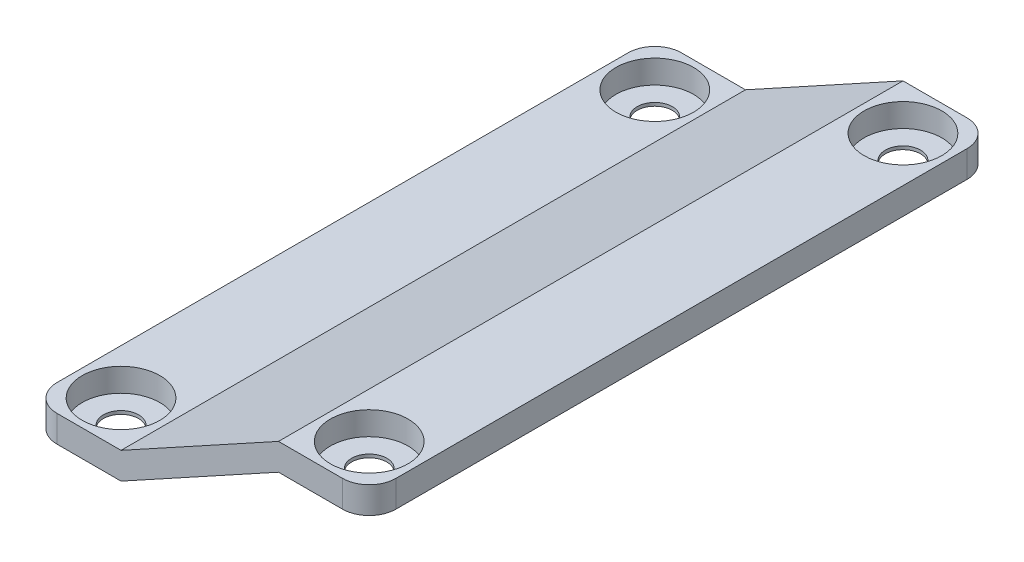
ISO-10303-21;
HEADER;
FILE_DESCRIPTION(('STEP AP214'),'2;1');
FILE_NAME('part.step','',(''),(''),'','','');
FILE_SCHEMA(('AUTOMOTIVE_DESIGN { 1 0 10303 214 1 1 1 1 }'));
ENDSEC;
DATA;
#1=APPLICATION_CONTEXT('core data for automotive mechanical design processes');
#2=APPLICATION_PROTOCOL_DEFINITION('international standard','automotive_design',2000,#1);
#3=PRODUCT_CONTEXT('',#1,'mechanical');
#4=PRODUCT('Part','Part','',(#3));
#5=PRODUCT_RELATED_PRODUCT_CATEGORY('part','',(#4));
#6=PRODUCT_DEFINITION_FORMATION('','',#4);
#7=PRODUCT_DEFINITION_CONTEXT('part definition',#1,'design');
#8=PRODUCT_DEFINITION('design','',#6,#7);
#9=PRODUCT_DEFINITION_SHAPE('','',#8);
#10=(LENGTH_UNIT() NAMED_UNIT(*) SI_UNIT(.MILLI.,.METRE.));
#11=(NAMED_UNIT(*) PLANE_ANGLE_UNIT() SI_UNIT($,.RADIAN.));
#12=(NAMED_UNIT(*) SI_UNIT($,.STERADIAN.) SOLID_ANGLE_UNIT());
#13=UNCERTAINTY_MEASURE_WITH_UNIT(LENGTH_MEASURE(1.E-05),#10,'distance_accuracy_value','');
#14=(GEOMETRIC_REPRESENTATION_CONTEXT(3) GLOBAL_UNCERTAINTY_ASSIGNED_CONTEXT((#13)) GLOBAL_UNIT_ASSIGNED_CONTEXT((#10,
#11,#12)) REPRESENTATION_CONTEXT('',''));
#15=CARTESIAN_POINT('',(0.,0.,0.));
#16=DIRECTION('',(0.,0.,1.));
#17=DIRECTION('',(1.,0.,0.));
#18=AXIS2_PLACEMENT_3D('',#15,#16,#17);
#19=CARTESIAN_POINT('',(-15.0077541769523,-9.56898329219079,-117.));
#20=DIRECTION('',(0.,-1.,0.));
#21=DIRECTION('',(1.,0.,0.));
#22=AXIS2_PLACEMENT_3D('',#19,#20,#21);
#23=PLANE('',#22);
#24=DIRECTION('',(0.,0.,1.));
#25=VECTOR('',#24,1.);
#26=CARTESIAN_POINT('',(-32.0077541769523,-9.5689832921908,-117.));
#27=LINE('',#26,#25);
#28=CARTESIAN_POINT('',(-32.0077541769523,-9.5689832921908,-112.));
#29=VERTEX_POINT('',#28);
#30=CARTESIAN_POINT('',(-32.0077541769523,-9.5689832921908,-5.));
#31=VERTEX_POINT('',#30);
#32=EDGE_CURVE('E198',#29,#31,#27,.T.);
#33=ORIENTED_EDGE('',*,*,#32,.F.);
#34=CARTESIAN_POINT('',(-27.0077541769523,-9.56898329219079,-112.));
#35=DIRECTION('',(0.,-1.,0.));
#36=DIRECTION('',(1.,0.,0.));
#37=AXIS2_PLACEMENT_3D('',#34,#35,#36);
#38=CIRCLE('',#37,5.);
#39=CARTESIAN_POINT('',(-27.0077541769523,-9.56898329219079,-117.));
#40=VERTEX_POINT('',#39);
#41=EDGE_CURVE('E228',#29,#40,#38,.T.);
#42=ORIENTED_EDGE('',*,*,#41,.T.);
#43=DIRECTION('',(1.,0.,0.));
#44=VECTOR('',#43,1.);
#45=CARTESIAN_POINT('',(-15.0077541769523,-9.56898329219079,-117.));
#46=LINE('',#45,#44);
#47=CARTESIAN_POINT('',(-15.0077541769523,-9.56898329219079,-117.));
#48=VERTEX_POINT('',#47);
#49=EDGE_CURVE('E141',#40,#48,#46,.T.);
#50=ORIENTED_EDGE('',*,*,#49,.T.);
#51=DIRECTION('',(0.,0.,1.));
#52=VECTOR('',#51,1.);
#53=CARTESIAN_POINT('',(-15.0077541769523,-9.56898329219079,-117.));
#54=LINE('',#53,#52);
#55=CARTESIAN_POINT('',(-15.0077541769523,-9.56898329219079,0.));
#56=VERTEX_POINT('',#55);
#57=EDGE_CURVE('E157',#48,#56,#54,.T.);
#58=ORIENTED_EDGE('',*,*,#57,.T.);
#59=DIRECTION('',(1.,0.,0.));
#60=VECTOR('',#59,1.);
#61=CARTESIAN_POINT('',(-15.0077541769523,-9.56898329219079,0.));
#62=LINE('',#61,#60);
#63=CARTESIAN_POINT('',(-27.0077541769523,-9.56898329219079,0.));
#64=VERTEX_POINT('',#63);
#65=EDGE_CURVE('E159',#64,#56,#62,.T.);
#66=ORIENTED_EDGE('',*,*,#65,.F.);
#67=CARTESIAN_POINT('',(-27.0077541769523,-9.56898329219079,-5.));
#68=DIRECTION('',(0.,-1.,0.));
#69=DIRECTION('',(1.,0.,0.));
#70=AXIS2_PLACEMENT_3D('',#67,#68,#69);
#71=CIRCLE('',#70,5.);
#72=EDGE_CURVE('E225',#64,#31,#71,.T.);
#73=ORIENTED_EDGE('',*,*,#72,.T.);
#74=EDGE_LOOP('',(#33,#42,#50,#58,#66,#73));
#75=FACE_BOUND('',#74,.T.);
#76=CARTESIAN_POINT('',(-23.5077541769523,-9.56898329219079,-8.5));
#77=DIRECTION('',(0.,1.,0.));
#78=DIRECTION('',(0.,0.,1.));
#79=AXIS2_PLACEMENT_3D('',#76,#77,#78);
#80=CIRCLE('',#79,3.3);
#81=CARTESIAN_POINT('',(-23.5077541769523,-9.56898329219079,-5.2));
#82=VERTEX_POINT('',#81);
#83=EDGE_CURVE('E165',#82,#82,#80,.T.);
#84=ORIENTED_EDGE('',*,*,#83,.T.);
#85=EDGE_LOOP('',(#84));
#86=FACE_BOUND('',#85,.T.);
#87=CARTESIAN_POINT('',(-23.5077541769523,-9.56898329219079,-108.5));
#88=DIRECTION('',(0.,1.,0.));
#89=DIRECTION('',(0.,0.,1.));
#90=AXIS2_PLACEMENT_3D('',#87,#88,#89);
#91=CIRCLE('',#90,3.3);
#92=CARTESIAN_POINT('',(-23.5077541769523,-9.56898329219079,-105.2));
#93=VERTEX_POINT('',#92);
#94=EDGE_CURVE('E364',#93,#93,#91,.T.);
#95=ORIENTED_EDGE('',*,*,#94,.T.);
#96=EDGE_LOOP('',(#95));
#97=FACE_BOUND('',#96,.T.);
#98=ADVANCED_FACE('F39',(#75,#86,#97),#23,.T.);
#99=CARTESIAN_POINT('',(-15.0077541769523,-9.56898329219079,-117.));
#100=DIRECTION('',(0.48134834326553,-0.876529390514391,0.));
#101=DIRECTION('',(0.876529390514391,0.48134834326553,0.));
#102=AXIS2_PLACEMENT_3D('',#99,#100,#101);
#103=PLANE('',#102);
#104=DIRECTION('',(0.876529390514391,0.48134834326553,0.));
#105=VECTOR('',#104,1.);
#106=CARTESIAN_POINT('',(-15.0077541769523,-9.56898329219079,0.));
#107=LINE('',#106,#105);
#108=CARTESIAN_POINT('',(14.4922458230477,6.6310167078092,0.));
#109=VERTEX_POINT('',#108);
#110=EDGE_CURVE('E180',#56,#109,#107,.T.);
#111=ORIENTED_EDGE('',*,*,#110,.F.);
#112=ORIENTED_EDGE('',*,*,#57,.F.);
#113=DIRECTION('',(0.876529390514391,0.48134834326553,0.));
#114=VECTOR('',#113,1.);
#115=CARTESIAN_POINT('',(-15.0077541769523,-9.56898329219079,-117.));
#116=LINE('',#115,#114);
#117=CARTESIAN_POINT('',(14.4922458230477,6.6310167078092,-117.));
#118=VERTEX_POINT('',#117);
#119=EDGE_CURVE('E147',#48,#118,#116,.T.);
#120=ORIENTED_EDGE('',*,*,#119,.T.);
#121=DIRECTION('',(0.,0.,1.));
#122=VECTOR('',#121,1.);
#123=CARTESIAN_POINT('',(14.4922458230477,6.6310167078092,-117.));
#124=LINE('',#123,#122);
#125=EDGE_CURVE('E129',#118,#109,#124,.T.);
#126=ORIENTED_EDGE('',*,*,#125,.T.);
#127=EDGE_LOOP('',(#111,#112,#120,#126));
#128=FACE_BOUND('',#127,.T.);
#129=ADVANCED_FACE('F155',(#128),#103,.T.);
#130=CARTESIAN_POINT('',(-32.0077541769523,-9.5689832921908,-117.));
#131=DIRECTION('',(-1.,0.,0.));
#132=DIRECTION('',(0.,0.,1.));
#133=AXIS2_PLACEMENT_3D('',#130,#131,#132);
#134=PLANE('',#133);
#135=DIRECTION('',(0.,0.,1.));
#136=VECTOR('',#135,1.);
#137=CARTESIAN_POINT('',(-32.0077541769523,-4.5689832921908,-117.));
#138=LINE('',#137,#136);
#139=CARTESIAN_POINT('',(-32.0077541769523,-4.5689832921908,-112.));
#140=VERTEX_POINT('',#139);
#141=CARTESIAN_POINT('',(-32.0077541769523,-4.5689832921908,-5.));
#142=VERTEX_POINT('',#141);
#143=EDGE_CURVE('E202',#140,#142,#138,.T.);
#144=ORIENTED_EDGE('',*,*,#143,.F.);
#145=DIRECTION('',(0.,-1.,0.));
#146=VECTOR('',#145,1.);
#147=CARTESIAN_POINT('',(-32.0077541769523,-9.5689832921908,-112.));
#148=LINE('',#147,#146);
#149=EDGE_CURVE('E221',#140,#29,#148,.T.);
#150=ORIENTED_EDGE('',*,*,#149,.T.);
#151=ORIENTED_EDGE('',*,*,#32,.T.);
#152=DIRECTION('',(0.,-1.,0.));
#153=VECTOR('',#152,1.);
#154=CARTESIAN_POINT('',(-32.0077541769523,-9.5689832921908,-5.));
#155=LINE('',#154,#153);
#156=EDGE_CURVE('E197',#31,#142,#155,.F.);
#157=ORIENTED_EDGE('',*,*,#156,.T.);
#158=EDGE_LOOP('',(#144,#150,#151,#157));
#159=FACE_BOUND('',#158,.T.);
#160=ADVANCED_FACE('F292',(#159),#134,.T.);
#161=CARTESIAN_POINT('',(-15.0077541769523,-4.5689832921908,-117.));
#162=DIRECTION('',(0.,1.,0.));
#163=DIRECTION('',(-1.,0.,0.));
#164=AXIS2_PLACEMENT_3D('',#161,#162,#163);
#165=PLANE('',#164);
#166=CARTESIAN_POINT('',(-23.5077541769523,-4.56898329219079,-108.5));
#167=DIRECTION('',(0.,1.,0.));
#168=DIRECTION('',(0.,0.,1.));
#169=AXIS2_PLACEMENT_3D('',#166,#167,#168);
#170=CIRCLE('',#169,7.275);
#171=CARTESIAN_POINT('',(-23.5077541769523,-4.56898329219079,-101.225));
#172=VERTEX_POINT('',#171);
#173=EDGE_CURVE('E344',#172,#172,#170,.T.);
#174=ORIENTED_EDGE('',*,*,#173,.F.);
#175=EDGE_LOOP('',(#174));
#176=FACE_BOUND('',#175,.T.);
#177=CARTESIAN_POINT('',(-23.5077541769523,-4.56898329219079,-8.5));
#178=DIRECTION('',(0.,1.,0.));
#179=DIRECTION('',(0.,0.,1.));
#180=AXIS2_PLACEMENT_3D('',#177,#178,#179);
#181=CIRCLE('',#180,7.275);
#182=CARTESIAN_POINT('',(-23.5077541769523,-4.56898329219079,-1.225));
#183=VERTEX_POINT('',#182);
#184=EDGE_CURVE('E368',#183,#183,#181,.T.);
#185=ORIENTED_EDGE('',*,*,#184,.F.);
#186=EDGE_LOOP('',(#185));
#187=FACE_BOUND('',#186,.T.);
#188=DIRECTION('',(-1.,0.,0.));
#189=VECTOR('',#188,1.);
#190=CARTESIAN_POINT('',(-15.0077541769523,-4.5689832921908,-117.));
#191=LINE('',#190,#189);
#192=CARTESIAN_POINT('',(-15.0077541769523,-4.5689832921908,-117.));
#193=VERTEX_POINT('',#192);
#194=CARTESIAN_POINT('',(-27.0077541769523,-4.5689832921908,-117.));
#195=VERTEX_POINT('',#194);
#196=EDGE_CURVE('E174',#193,#195,#191,.T.);
#197=ORIENTED_EDGE('',*,*,#196,.T.);
#198=CARTESIAN_POINT('',(-27.0077541769523,-4.5689832921908,-112.));
#199=DIRECTION('',(0.,1.,0.));
#200=DIRECTION('',(-1.,0.,0.));
#201=AXIS2_PLACEMENT_3D('',#198,#199,#200);
#202=CIRCLE('',#201,5.);
#203=EDGE_CURVE('E239',#195,#140,#202,.T.);
#204=ORIENTED_EDGE('',*,*,#203,.T.);
#205=ORIENTED_EDGE('',*,*,#143,.T.);
#206=CARTESIAN_POINT('',(-27.0077541769523,-4.5689832921908,-5.));
#207=DIRECTION('',(0.,1.,0.));
#208=DIRECTION('',(-1.,0.,0.));
#209=AXIS2_PLACEMENT_3D('',#206,#207,#208);
#210=CIRCLE('',#209,5.);
#211=CARTESIAN_POINT('',(-27.0077541769523,-4.5689832921908,0.));
#212=VERTEX_POINT('',#211);
#213=EDGE_CURVE('E236',#142,#212,#210,.T.);
#214=ORIENTED_EDGE('',*,*,#213,.T.);
#215=DIRECTION('',(-1.,0.,0.));
#216=VECTOR('',#215,1.);
#217=CARTESIAN_POINT('',(-15.0077541769523,-4.5689832921908,0.));
#218=LINE('',#217,#216);
#219=CARTESIAN_POINT('',(-15.0077541769523,-4.5689832921908,0.));
#220=VERTEX_POINT('',#219);
#221=EDGE_CURVE('E162',#220,#212,#218,.T.);
#222=ORIENTED_EDGE('',*,*,#221,.F.);
#223=DIRECTION('',(0.,0.,1.));
#224=VECTOR('',#223,1.);
#225=CARTESIAN_POINT('',(-15.0077541769523,-4.5689832921908,-117.));
#226=LINE('',#225,#224);
#227=EDGE_CURVE('E206',#193,#220,#226,.T.);
#228=ORIENTED_EDGE('',*,*,#227,.F.);
#229=EDGE_LOOP('',(#197,#204,#205,#214,#222,#228));
#230=FACE_BOUND('',#229,.T.);
#231=ADVANCED_FACE('F288',(#176,#187,#230),#165,.T.);
#232=CARTESIAN_POINT('',(-15.0077541769523,-4.5689832921908,-117.));
#233=DIRECTION('',(-0.48134834326553,0.876529390514391,0.));
#234=DIRECTION('',(-0.876529390514391,-0.48134834326553,0.));
#235=AXIS2_PLACEMENT_3D('',#232,#233,#234);
#236=PLANE('',#235);
#237=DIRECTION('',(-0.876529390514391,-0.48134834326553,0.));
#238=VECTOR('',#237,1.);
#239=CARTESIAN_POINT('',(-15.0077541769523,-4.5689832921908,0.));
#240=LINE('',#239,#238);
#241=CARTESIAN_POINT('',(14.4922458230477,11.6310167078092,0.));
#242=VERTEX_POINT('',#241);
#243=EDGE_CURVE('E188',#242,#220,#240,.T.);
#244=ORIENTED_EDGE('',*,*,#243,.F.);
#245=DIRECTION('',(0.,0.,1.));
#246=VECTOR('',#245,1.);
#247=CARTESIAN_POINT('',(14.4922458230477,11.6310167078092,-117.));
#248=LINE('',#247,#246);
#249=CARTESIAN_POINT('',(14.4922458230477,11.6310167078092,-117.));
#250=VERTEX_POINT('',#249);
#251=EDGE_CURVE('E209',#250,#242,#248,.T.);
#252=ORIENTED_EDGE('',*,*,#251,.F.);
#253=DIRECTION('',(-0.876529390514391,-0.48134834326553,0.));
#254=VECTOR('',#253,1.);
#255=CARTESIAN_POINT('',(-15.0077541769523,-4.5689832921908,-117.));
#256=LINE('',#255,#254);
#257=EDGE_CURVE('E170',#250,#193,#256,.T.);
#258=ORIENTED_EDGE('',*,*,#257,.T.);
#259=ORIENTED_EDGE('',*,*,#227,.T.);
#260=EDGE_LOOP('',(#244,#252,#258,#259));
#261=FACE_BOUND('',#260,.T.);
#262=ADVANCED_FACE('F284',(#261),#236,.T.);
#263=CARTESIAN_POINT('',(14.4922458230477,11.6310167078092,-117.));
#264=DIRECTION('',(0.,1.,0.));
#265=DIRECTION('',(0.,0.,1.));
#266=AXIS2_PLACEMENT_3D('',#263,#264,#265);
#267=PLANE('',#266);
#268=CARTESIAN_POINT('',(22.9922458230477,11.6310167078092,-8.49999999999999));
#269=DIRECTION('',(0.,1.,0.));
#270=DIRECTION('',(0.,0.,1.));
#271=AXIS2_PLACEMENT_3D('',#268,#269,#270);
#272=CIRCLE('',#271,7.275);
#273=CARTESIAN_POINT('',(22.9922458230477,11.6310167078092,-1.22499999999999));
#274=VERTEX_POINT('',#273);
#275=EDGE_CURVE('E440',#274,#274,#272,.T.);
#276=ORIENTED_EDGE('',*,*,#275,.F.);
#277=EDGE_LOOP('',(#276));
#278=FACE_BOUND('',#277,.T.);
#279=CARTESIAN_POINT('',(22.9922458230477,11.6310167078092,-108.5));
#280=DIRECTION('',(0.,1.,0.));
#281=DIRECTION('',(0.,0.,1.));
#282=AXIS2_PLACEMENT_3D('',#279,#280,#281);
#283=CIRCLE('',#282,7.275);
#284=CARTESIAN_POINT('',(22.9922458230477,11.6310167078092,-101.225));
#285=VERTEX_POINT('',#284);
#286=EDGE_CURVE('E450',#285,#285,#283,.T.);
#287=ORIENTED_EDGE('',*,*,#286,.F.);
#288=EDGE_LOOP('',(#287));
#289=FACE_BOUND('',#288,.T.);
#290=DIRECTION('',(0.,0.,1.));
#291=VECTOR('',#290,1.);
#292=CARTESIAN_POINT('',(31.4922458230477,11.6310167078092,-117.));
#293=LINE('',#292,#291);
#294=CARTESIAN_POINT('',(31.4922458230477,11.6310167078092,-112.));
#295=VERTEX_POINT('',#294);
#296=CARTESIAN_POINT('',(31.4922458230477,11.6310167078092,-5.));
#297=VERTEX_POINT('',#296);
#298=EDGE_CURVE('E213',#295,#297,#293,.T.);
#299=ORIENTED_EDGE('',*,*,#298,.F.);
#300=CARTESIAN_POINT('',(26.4922458230477,11.6310167078092,-112.));
#301=DIRECTION('',(0.,1.,0.));
#302=DIRECTION('',(0.,0.,1.));
#303=AXIS2_PLACEMENT_3D('',#300,#301,#302);
#304=CIRCLE('',#303,5.);
#305=CARTESIAN_POINT('',(26.4922458230477,11.6310167078092,-117.));
#306=VERTEX_POINT('',#305);
#307=EDGE_CURVE('E251',#295,#306,#304,.T.);
#308=ORIENTED_EDGE('',*,*,#307,.T.);
#309=DIRECTION('',(-1.,0.,0.));
#310=VECTOR('',#309,1.);
#311=CARTESIAN_POINT('',(14.4922458230477,11.6310167078092,-117.));
#312=LINE('',#311,#310);
#313=EDGE_CURVE('E152',#306,#250,#312,.T.);
#314=ORIENTED_EDGE('',*,*,#313,.T.);
#315=ORIENTED_EDGE('',*,*,#251,.T.);
#316=DIRECTION('',(-1.,0.,0.));
#317=VECTOR('',#316,1.);
#318=CARTESIAN_POINT('',(14.4922458230477,11.6310167078092,0.));
#319=LINE('',#318,#317);
#320=CARTESIAN_POINT('',(26.4922458230477,11.6310167078092,0.));
#321=VERTEX_POINT('',#320);
#322=EDGE_CURVE('E185',#321,#242,#319,.T.);
#323=ORIENTED_EDGE('',*,*,#322,.F.);
#324=CARTESIAN_POINT('',(26.4922458230477,11.6310167078092,-5.));
#325=DIRECTION('',(0.,1.,0.));
#326=DIRECTION('',(0.,0.,1.));
#327=AXIS2_PLACEMENT_3D('',#324,#325,#326);
#328=CIRCLE('',#327,5.);
#329=EDGE_CURVE('E63',#321,#297,#328,.T.);
#330=ORIENTED_EDGE('',*,*,#329,.T.);
#331=EDGE_LOOP('',(#299,#308,#314,#315,#323,#330));
#332=FACE_BOUND('',#331,.T.);
#333=ADVANCED_FACE('F280',(#278,#289,#332),#267,.T.);
#334=CARTESIAN_POINT('',(31.4922458230477,6.6310167078092,-117.));
#335=DIRECTION('',(1.,0.,0.));
#336=DIRECTION('',(0.,0.,-1.));
#337=AXIS2_PLACEMENT_3D('',#334,#335,#336);
#338=PLANE('',#337);
#339=DIRECTION('',(0.,0.,1.));
#340=VECTOR('',#339,1.);
#341=CARTESIAN_POINT('',(31.4922458230477,6.6310167078092,-117.));
#342=LINE('',#341,#340);
#343=CARTESIAN_POINT('',(31.4922458230477,6.6310167078092,-112.));
#344=VERTEX_POINT('',#343);
#345=CARTESIAN_POINT('',(31.4922458230477,6.6310167078092,-5.));
#346=VERTEX_POINT('',#345);
#347=EDGE_CURVE('E140',#344,#346,#342,.T.);
#348=ORIENTED_EDGE('',*,*,#347,.F.);
#349=DIRECTION('',(0.,1.,0.));
#350=VECTOR('',#349,1.);
#351=CARTESIAN_POINT('',(31.4922458230477,11.6310167078092,-112.));
#352=LINE('',#351,#350);
#353=EDGE_CURVE('E245',#344,#295,#352,.T.);
#354=ORIENTED_EDGE('',*,*,#353,.T.);
#355=ORIENTED_EDGE('',*,*,#298,.T.);
#356=DIRECTION('',(0.,1.,0.));
#357=VECTOR('',#356,1.);
#358=CARTESIAN_POINT('',(31.4922458230477,6.6310167078092,-5.));
#359=LINE('',#358,#357);
#360=EDGE_CURVE('E242',#297,#346,#359,.F.);
#361=ORIENTED_EDGE('',*,*,#360,.T.);
#362=EDGE_LOOP('',(#348,#354,#355,#361));
#363=FACE_BOUND('',#362,.T.);
#364=ADVANCED_FACE('F274',(#363),#338,.T.);
#365=CARTESIAN_POINT('',(14.4922458230477,6.6310167078092,-117.));
#366=DIRECTION('',(0.,-1.,0.));
#367=DIRECTION('',(0.,0.,-1.));
#368=AXIS2_PLACEMENT_3D('',#365,#366,#367);
#369=PLANE('',#368);
#370=CARTESIAN_POINT('',(22.9922458230477,6.6310167078092,-8.49999999999999));
#371=DIRECTION('',(0.,-1.,0.));
#372=DIRECTION('',(0.,0.,-1.));
#373=AXIS2_PLACEMENT_3D('',#370,#371,#372);
#374=CIRCLE('',#373,3.3);
#375=CARTESIAN_POINT('',(22.9922458230477,6.6310167078092,-11.8));
#376=VERTEX_POINT('',#375);
#377=EDGE_CURVE('E338',#376,#376,#374,.T.);
#378=ORIENTED_EDGE('',*,*,#377,.F.);
#379=EDGE_LOOP('',(#378));
#380=FACE_BOUND('',#379,.T.);
#381=CARTESIAN_POINT('',(22.9922458230477,6.6310167078092,-108.5));
#382=DIRECTION('',(0.,-1.,0.));
#383=DIRECTION('',(0.,0.,-1.));
#384=AXIS2_PLACEMENT_3D('',#381,#382,#383);
#385=CIRCLE('',#384,3.3);
#386=CARTESIAN_POINT('',(22.9922458230477,6.6310167078092,-111.8));
#387=VERTEX_POINT('',#386);
#388=EDGE_CURVE('E341',#387,#387,#385,.T.);
#389=ORIENTED_EDGE('',*,*,#388,.F.);
#390=EDGE_LOOP('',(#389));
#391=FACE_BOUND('',#390,.T.);
#392=DIRECTION('',(1.,0.,0.));
#393=VECTOR('',#392,1.);
#394=CARTESIAN_POINT('',(14.4922458230477,6.6310167078092,-117.));
#395=LINE('',#394,#393);
#396=CARTESIAN_POINT('',(26.4922458230477,6.6310167078092,-117.));
#397=VERTEX_POINT('',#396);
#398=EDGE_CURVE('E132',#118,#397,#395,.T.);
#399=ORIENTED_EDGE('',*,*,#398,.T.);
#400=CARTESIAN_POINT('',(26.4922458230477,6.6310167078092,-112.));
#401=DIRECTION('',(0.,-1.,0.));
#402=DIRECTION('',(0.,0.,-1.));
#403=AXIS2_PLACEMENT_3D('',#400,#401,#402);
#404=CIRCLE('',#403,5.);
#405=EDGE_CURVE('E256',#397,#344,#404,.T.);
#406=ORIENTED_EDGE('',*,*,#405,.T.);
#407=ORIENTED_EDGE('',*,*,#347,.T.);
#408=CARTESIAN_POINT('',(26.4922458230477,6.6310167078092,-5.));
#409=DIRECTION('',(0.,-1.,0.));
#410=DIRECTION('',(0.,0.,-1.));
#411=AXIS2_PLACEMENT_3D('',#408,#409,#410);
#412=CIRCLE('',#411,5.);
#413=CARTESIAN_POINT('',(26.4922458230477,6.6310167078092,0.));
#414=VERTEX_POINT('',#413);
#415=EDGE_CURVE('E55',#346,#414,#412,.T.);
#416=ORIENTED_EDGE('',*,*,#415,.T.);
#417=DIRECTION('',(1.,0.,0.));
#418=VECTOR('',#417,1.);
#419=CARTESIAN_POINT('',(14.4922458230477,6.6310167078092,0.));
#420=LINE('',#419,#418);
#421=EDGE_CURVE('E134',#109,#414,#420,.T.);
#422=ORIENTED_EDGE('',*,*,#421,.F.);
#423=ORIENTED_EDGE('',*,*,#125,.F.);
#424=EDGE_LOOP('',(#399,#406,#407,#416,#422,#423));
#425=FACE_BOUND('',#424,.T.);
#426=ADVANCED_FACE('F131',(#380,#391,#425),#369,.T.);
#427=CARTESIAN_POINT('',(0.,0.,-117.));
#428=DIRECTION('',(0.,0.,1.));
#429=DIRECTION('',(1.,0.,0.));
#430=AXIS2_PLACEMENT_3D('',#427,#428,#429);
#431=PLANE('',#430);
#432=ORIENTED_EDGE('',*,*,#49,.F.);
#433=DIRECTION('',(0.,-1.,0.));
#434=VECTOR('',#433,1.);
#435=CARTESIAN_POINT('',(-27.0077541769523,-4.5689832921908,-117.));
#436=LINE('',#435,#434);
#437=EDGE_CURVE('E233',#40,#195,#436,.F.);
#438=ORIENTED_EDGE('',*,*,#437,.T.);
#439=ORIENTED_EDGE('',*,*,#196,.F.);
#440=ORIENTED_EDGE('',*,*,#257,.F.);
#441=ORIENTED_EDGE('',*,*,#313,.F.);
#442=DIRECTION('',(0.,1.,0.));
#443=VECTOR('',#442,1.);
#444=CARTESIAN_POINT('',(26.4922458230477,6.6310167078092,-117.));
#445=LINE('',#444,#443);
#446=EDGE_CURVE('E150',#306,#397,#445,.F.);
#447=ORIENTED_EDGE('',*,*,#446,.T.);
#448=ORIENTED_EDGE('',*,*,#398,.F.);
#449=ORIENTED_EDGE('',*,*,#119,.F.);
#450=EDGE_LOOP('',(#432,#438,#439,#440,#441,#447,#448,#449));
#451=FACE_BOUND('',#450,.T.);
#452=ADVANCED_FACE('F146',(#451),#431,.F.);
#453=CARTESIAN_POINT('',(0.,0.,0.));
#454=DIRECTION('',(0.,0.,1.));
#455=DIRECTION('',(1.,0.,0.));
#456=AXIS2_PLACEMENT_3D('',#453,#454,#455);
#457=PLANE('',#456);
#458=ORIENTED_EDGE('',*,*,#421,.T.);
#459=DIRECTION('',(0.,1.,0.));
#460=VECTOR('',#459,1.);
#461=CARTESIAN_POINT('',(26.4922458230477,0.,0.));
#462=LINE('',#461,#460);
#463=EDGE_CURVE('E11',#414,#321,#462,.T.);
#464=ORIENTED_EDGE('',*,*,#463,.T.);
#465=ORIENTED_EDGE('',*,*,#322,.T.);
#466=ORIENTED_EDGE('',*,*,#243,.T.);
#467=ORIENTED_EDGE('',*,*,#221,.T.);
#468=DIRECTION('',(0.,-1.,0.));
#469=VECTOR('',#468,1.);
#470=CARTESIAN_POINT('',(-27.0077541769523,0.,0.));
#471=LINE('',#470,#469);
#472=EDGE_CURVE('E48',#212,#64,#471,.T.);
#473=ORIENTED_EDGE('',*,*,#472,.T.);
#474=ORIENTED_EDGE('',*,*,#65,.T.);
#475=ORIENTED_EDGE('',*,*,#110,.T.);
#476=EDGE_LOOP('',(#458,#464,#465,#466,#467,#473,#474,#475));
#477=FACE_BOUND('',#476,.T.);
#478=ADVANCED_FACE('F263',(#477),#457,.T.);
#479=CARTESIAN_POINT('',(-23.5077541769523,-4.56898329219079,-8.5));
#480=DIRECTION('',(0.,1.,0.));
#481=DIRECTION('',(0.,0.,1.));
#482=AXIS2_PLACEMENT_3D('',#479,#480,#481);
#483=CYLINDRICAL_SURFACE('',#482,3.3);
#484=ORIENTED_EDGE('',*,*,#83,.F.);
#485=EDGE_LOOP('',(#484));
#486=FACE_BOUND('',#485,.T.);
#487=CARTESIAN_POINT('',(-23.5077541769523,-8.94898329219079,-8.5));
#488=DIRECTION('',(0.,1.,0.));
#489=DIRECTION('',(0.,0.,1.));
#490=AXIS2_PLACEMENT_3D('',#487,#488,#489);
#491=CIRCLE('',#490,3.3);
#492=CARTESIAN_POINT('',(-23.5077541769523,-8.94898329219079,-5.2));
#493=VERTEX_POINT('',#492);
#494=EDGE_CURVE('E375',#493,#493,#491,.T.);
#495=ORIENTED_EDGE('',*,*,#494,.T.);
#496=EDGE_LOOP('',(#495));
#497=FACE_BOUND('',#496,.T.);
#498=ADVANCED_FACE('F385',(#486,#497),#483,.F.);
#499=CARTESIAN_POINT('',(-20.2077541769523,-8.94898329219079,-8.5));
#500=DIRECTION('',(0.,-1.,0.));
#501=DIRECTION('',(0.,0.,-1.));
#502=AXIS2_PLACEMENT_3D('',#499,#500,#501);
#503=PLANE('',#502);
#504=ORIENTED_EDGE('',*,*,#494,.F.);
#505=EDGE_LOOP('',(#504));
#506=FACE_BOUND('',#505,.T.);
#507=CARTESIAN_POINT('',(-23.5077541769523,-8.94898329219079,-8.5));
#508=DIRECTION('',(0.,1.,0.));
#509=DIRECTION('',(0.,0.,1.));
#510=AXIS2_PLACEMENT_3D('',#507,#508,#509);
#511=CIRCLE('',#510,7.275);
#512=CARTESIAN_POINT('',(-23.5077541769523,-8.94898329219079,-1.225));
#513=VERTEX_POINT('',#512);
#514=EDGE_CURVE('E372',#513,#513,#511,.T.);
#515=ORIENTED_EDGE('',*,*,#514,.T.);
#516=EDGE_LOOP('',(#515));
#517=FACE_BOUND('',#516,.T.);
#518=ADVANCED_FACE('F387',(#506,#517),#503,.F.);
#519=CARTESIAN_POINT('',(-23.5077541769523,-4.56898329219079,-8.5));
#520=DIRECTION('',(0.,1.,0.));
#521=DIRECTION('',(0.,0.,1.));
#522=AXIS2_PLACEMENT_3D('',#519,#520,#521);
#523=CYLINDRICAL_SURFACE('',#522,7.275);
#524=ORIENTED_EDGE('',*,*,#514,.F.);
#525=EDGE_LOOP('',(#524));
#526=FACE_BOUND('',#525,.T.);
#527=ORIENTED_EDGE('',*,*,#184,.T.);
#528=EDGE_LOOP('',(#527));
#529=FACE_BOUND('',#528,.T.);
#530=ADVANCED_FACE('F393',(#526,#529),#523,.F.);
#531=CARTESIAN_POINT('',(-23.5077541769523,-4.56898329219079,-108.5));
#532=DIRECTION('',(0.,1.,0.));
#533=DIRECTION('',(0.,0.,1.));
#534=AXIS2_PLACEMENT_3D('',#531,#532,#533);
#535=CYLINDRICAL_SURFACE('',#534,3.3);
#536=ORIENTED_EDGE('',*,*,#94,.F.);
#537=EDGE_LOOP('',(#536));
#538=FACE_BOUND('',#537,.T.);
#539=CARTESIAN_POINT('',(-23.5077541769523,-8.94898329219079,-108.5));
#540=DIRECTION('',(0.,1.,0.));
#541=DIRECTION('',(0.,0.,1.));
#542=AXIS2_PLACEMENT_3D('',#539,#540,#541);
#543=CIRCLE('',#542,3.3);
#544=CARTESIAN_POINT('',(-23.5077541769523,-8.94898329219079,-105.2));
#545=VERTEX_POINT('',#544);
#546=EDGE_CURVE('E360',#545,#545,#543,.T.);
#547=ORIENTED_EDGE('',*,*,#546,.T.);
#548=EDGE_LOOP('',(#547));
#549=FACE_BOUND('',#548,.T.);
#550=ADVANCED_FACE('F399',(#538,#549),#535,.F.);
#551=CARTESIAN_POINT('',(-20.2077541769523,-8.94898329219079,-108.5));
#552=DIRECTION('',(0.,-1.,0.));
#553=DIRECTION('',(0.,0.,-1.));
#554=AXIS2_PLACEMENT_3D('',#551,#552,#553);
#555=PLANE('',#554);
#556=ORIENTED_EDGE('',*,*,#546,.F.);
#557=EDGE_LOOP('',(#556));
#558=FACE_BOUND('',#557,.T.);
#559=CARTESIAN_POINT('',(-23.5077541769523,-8.94898329219079,-108.5));
#560=DIRECTION('',(0.,1.,0.));
#561=DIRECTION('',(0.,0.,1.));
#562=AXIS2_PLACEMENT_3D('',#559,#560,#561);
#563=CIRCLE('',#562,7.275);
#564=CARTESIAN_POINT('',(-23.5077541769523,-8.94898329219079,-101.225));
#565=VERTEX_POINT('',#564);
#566=EDGE_CURVE('E350',#565,#565,#563,.T.);
#567=ORIENTED_EDGE('',*,*,#566,.T.);
#568=EDGE_LOOP('',(#567));
#569=FACE_BOUND('',#568,.T.);
#570=ADVANCED_FACE('F403',(#558,#569),#555,.F.);
#571=CARTESIAN_POINT('',(-23.5077541769523,-4.56898329219079,-108.5));
#572=DIRECTION('',(0.,1.,0.));
#573=DIRECTION('',(0.,0.,1.));
#574=AXIS2_PLACEMENT_3D('',#571,#572,#573);
#575=CYLINDRICAL_SURFACE('',#574,7.275);
#576=ORIENTED_EDGE('',*,*,#566,.F.);
#577=EDGE_LOOP('',(#576));
#578=FACE_BOUND('',#577,.T.);
#579=ORIENTED_EDGE('',*,*,#173,.T.);
#580=EDGE_LOOP('',(#579));
#581=FACE_BOUND('',#580,.T.);
#582=ADVANCED_FACE('F407',(#578,#581),#575,.F.);
#583=CARTESIAN_POINT('',(22.9922458230477,11.6310167078092,-108.5));
#584=DIRECTION('',(0.,1.,0.));
#585=DIRECTION('',(0.,0.,1.));
#586=AXIS2_PLACEMENT_3D('',#583,#584,#585);
#587=CYLINDRICAL_SURFACE('',#586,3.3);
#588=CARTESIAN_POINT('',(22.9922458230477,7.25101670780921,-108.5));
#589=DIRECTION('',(0.,1.,0.));
#590=DIRECTION('',(0.,0.,1.));
#591=AXIS2_PLACEMENT_3D('',#588,#589,#590);
#592=CIRCLE('',#591,3.3);
#593=CARTESIAN_POINT('',(22.9922458230477,7.25101670780921,-105.2));
#594=VERTEX_POINT('',#593);
#595=EDGE_CURVE('E345',#594,#594,#592,.T.);
#596=ORIENTED_EDGE('',*,*,#595,.T.);
#597=EDGE_LOOP('',(#596));
#598=FACE_BOUND('',#597,.T.);
#599=ORIENTED_EDGE('',*,*,#388,.T.);
#600=EDGE_LOOP('',(#599));
#601=FACE_BOUND('',#600,.T.);
#602=ADVANCED_FACE('F411',(#598,#601),#587,.F.);
#603=CARTESIAN_POINT('',(26.2922458230477,7.25101670780921,-108.5));
#604=DIRECTION('',(0.,-1.,0.));
#605=DIRECTION('',(0.,0.,-1.));
#606=AXIS2_PLACEMENT_3D('',#603,#604,#605);
#607=PLANE('',#606);
#608=ORIENTED_EDGE('',*,*,#595,.F.);
#609=EDGE_LOOP('',(#608));
#610=FACE_BOUND('',#609,.T.);
#611=CARTESIAN_POINT('',(22.9922458230477,7.25101670780921,-108.5));
#612=DIRECTION('',(0.,1.,0.));
#613=DIRECTION('',(0.,0.,1.));
#614=AXIS2_PLACEMENT_3D('',#611,#612,#613);
#615=CIRCLE('',#614,7.275);
#616=CARTESIAN_POINT('',(22.9922458230477,7.25101670780921,-101.225));
#617=VERTEX_POINT('',#616);
#618=EDGE_CURVE('E353',#617,#617,#615,.T.);
#619=ORIENTED_EDGE('',*,*,#618,.T.);
#620=EDGE_LOOP('',(#619));
#621=FACE_BOUND('',#620,.T.);
#622=ADVANCED_FACE('F415',(#610,#621),#607,.F.);
#623=CARTESIAN_POINT('',(22.9922458230477,11.6310167078092,-108.5));
#624=DIRECTION('',(0.,1.,0.));
#625=DIRECTION('',(0.,0.,1.));
#626=AXIS2_PLACEMENT_3D('',#623,#624,#625);
#627=CYLINDRICAL_SURFACE('',#626,7.275);
#628=ORIENTED_EDGE('',*,*,#618,.F.);
#629=EDGE_LOOP('',(#628));
#630=FACE_BOUND('',#629,.T.);
#631=ORIENTED_EDGE('',*,*,#286,.T.);
#632=EDGE_LOOP('',(#631));
#633=FACE_BOUND('',#632,.T.);
#634=ADVANCED_FACE('F419',(#630,#633),#627,.F.);
#635=CARTESIAN_POINT('',(22.9922458230477,11.6310167078092,-8.49999999999999));
#636=DIRECTION('',(0.,1.,0.));
#637=DIRECTION('',(0.,0.,1.));
#638=AXIS2_PLACEMENT_3D('',#635,#636,#637);
#639=CYLINDRICAL_SURFACE('',#638,3.3);
#640=CARTESIAN_POINT('',(22.9922458230477,7.25101670780921,-8.49999999999999));
#641=DIRECTION('',(0.,1.,0.));
#642=DIRECTION('',(0.,0.,1.));
#643=AXIS2_PLACEMENT_3D('',#640,#641,#642);
#644=CIRCLE('',#643,3.3);
#645=CARTESIAN_POINT('',(22.9922458230477,7.25101670780921,-5.19999999999999));
#646=VERTEX_POINT('',#645);
#647=EDGE_CURVE('E435',#646,#646,#644,.T.);
#648=ORIENTED_EDGE('',*,*,#647,.T.);
#649=EDGE_LOOP('',(#648));
#650=FACE_BOUND('',#649,.T.);
#651=ORIENTED_EDGE('',*,*,#377,.T.);
#652=EDGE_LOOP('',(#651));
#653=FACE_BOUND('',#652,.T.);
#654=ADVANCED_FACE('F423',(#650,#653),#639,.F.);
#655=CARTESIAN_POINT('',(26.2922458230477,7.25101670780921,-8.49999999999999));
#656=DIRECTION('',(0.,-1.,0.));
#657=DIRECTION('',(0.,0.,-1.));
#658=AXIS2_PLACEMENT_3D('',#655,#656,#657);
#659=PLANE('',#658);
#660=ORIENTED_EDGE('',*,*,#647,.F.);
#661=EDGE_LOOP('',(#660));
#662=FACE_BOUND('',#661,.T.);
#663=CARTESIAN_POINT('',(22.9922458230477,7.25101670780921,-8.49999999999999));
#664=DIRECTION('',(0.,1.,0.));
#665=DIRECTION('',(0.,0.,1.));
#666=AXIS2_PLACEMENT_3D('',#663,#664,#665);
#667=CIRCLE('',#666,7.275);
#668=CARTESIAN_POINT('',(22.9922458230477,7.25101670780921,-1.22499999999999));
#669=VERTEX_POINT('',#668);
#670=EDGE_CURVE('E438',#669,#669,#667,.T.);
#671=ORIENTED_EDGE('',*,*,#670,.T.);
#672=EDGE_LOOP('',(#671));
#673=FACE_BOUND('',#672,.T.);
#674=ADVANCED_FACE('F306',(#662,#673),#659,.F.);
#675=CARTESIAN_POINT('',(22.9922458230477,11.6310167078092,-8.49999999999999));
#676=DIRECTION('',(0.,1.,0.));
#677=DIRECTION('',(0.,0.,1.));
#678=AXIS2_PLACEMENT_3D('',#675,#676,#677);
#679=CYLINDRICAL_SURFACE('',#678,7.275);
#680=ORIENTED_EDGE('',*,*,#670,.F.);
#681=EDGE_LOOP('',(#680));
#682=FACE_BOUND('',#681,.T.);
#683=ORIENTED_EDGE('',*,*,#275,.T.);
#684=EDGE_LOOP('',(#683));
#685=FACE_BOUND('',#684,.T.);
#686=ADVANCED_FACE('F299',(#682,#685),#679,.F.);
#687=CARTESIAN_POINT('',(-27.0077541769523,-9.5689832921908,-112.));
#688=DIRECTION('',(0.,1.,0.));
#689=DIRECTION('',(0.,0.,1.));
#690=AXIS2_PLACEMENT_3D('',#687,#688,#689);
#691=CYLINDRICAL_SURFACE('',#690,5.);
#692=ORIENTED_EDGE('',*,*,#203,.F.);
#693=ORIENTED_EDGE('',*,*,#437,.F.);
#694=ORIENTED_EDGE('',*,*,#41,.F.);
#695=ORIENTED_EDGE('',*,*,#149,.F.);
#696=EDGE_LOOP('',(#692,#693,#694,#695));
#697=FACE_BOUND('',#696,.T.);
#698=ADVANCED_FACE('F297',(#697),#691,.T.);
#699=CARTESIAN_POINT('',(26.4922458230477,6.6310167078092,-112.));
#700=DIRECTION('',(0.,-1.,0.));
#701=DIRECTION('',(0.,0.,-1.));
#702=AXIS2_PLACEMENT_3D('',#699,#700,#701);
#703=CYLINDRICAL_SURFACE('',#702,5.);
#704=ORIENTED_EDGE('',*,*,#405,.F.);
#705=ORIENTED_EDGE('',*,*,#446,.F.);
#706=ORIENTED_EDGE('',*,*,#307,.F.);
#707=ORIENTED_EDGE('',*,*,#353,.F.);
#708=EDGE_LOOP('',(#704,#705,#706,#707));
#709=FACE_BOUND('',#708,.T.);
#710=ADVANCED_FACE('F278',(#709),#703,.T.);
#711=CARTESIAN_POINT('',(26.4922458230477,0.,-5.));
#712=DIRECTION('',(0.,1.,0.));
#713=DIRECTION('',(0.,0.,1.));
#714=AXIS2_PLACEMENT_3D('',#711,#712,#713);
#715=CYLINDRICAL_SURFACE('',#714,5.);
#716=ORIENTED_EDGE('',*,*,#415,.F.);
#717=ORIENTED_EDGE('',*,*,#360,.F.);
#718=ORIENTED_EDGE('',*,*,#329,.F.);
#719=ORIENTED_EDGE('',*,*,#463,.F.);
#720=EDGE_LOOP('',(#716,#717,#718,#719));
#721=FACE_BOUND('',#720,.T.);
#722=ADVANCED_FACE('F271',(#721),#715,.T.);
#723=CARTESIAN_POINT('',(-27.0077541769523,0.,-5.));
#724=DIRECTION('',(0.,-1.,0.));
#725=DIRECTION('',(0.,0.,-1.));
#726=AXIS2_PLACEMENT_3D('',#723,#724,#725);
#727=CYLINDRICAL_SURFACE('',#726,5.);
#728=ORIENTED_EDGE('',*,*,#213,.F.);
#729=ORIENTED_EDGE('',*,*,#156,.F.);
#730=ORIENTED_EDGE('',*,*,#72,.F.);
#731=ORIENTED_EDGE('',*,*,#472,.F.);
#732=EDGE_LOOP('',(#728,#729,#730,#731));
#733=FACE_BOUND('',#732,.T.);
#734=ADVANCED_FACE('F41',(#733),#727,.T.);
#735=CLOSED_SHELL('',(#98,#129,#160,#231,#262,#333,#364,#426,#452,#478,#498,#518,#530,#550,#570,
#582,#602,#622,#634,#654,#674,#686,#698,#710,#722,#734));
#736=MANIFOLD_SOLID_BREP('B2',#735);
#737=ADVANCED_BREP_SHAPE_REPRESENTATION('',(#18,#736),#14);
#738=SHAPE_DEFINITION_REPRESENTATION(#9,#737);
ENDSEC;
END-ISO-10303-21;
